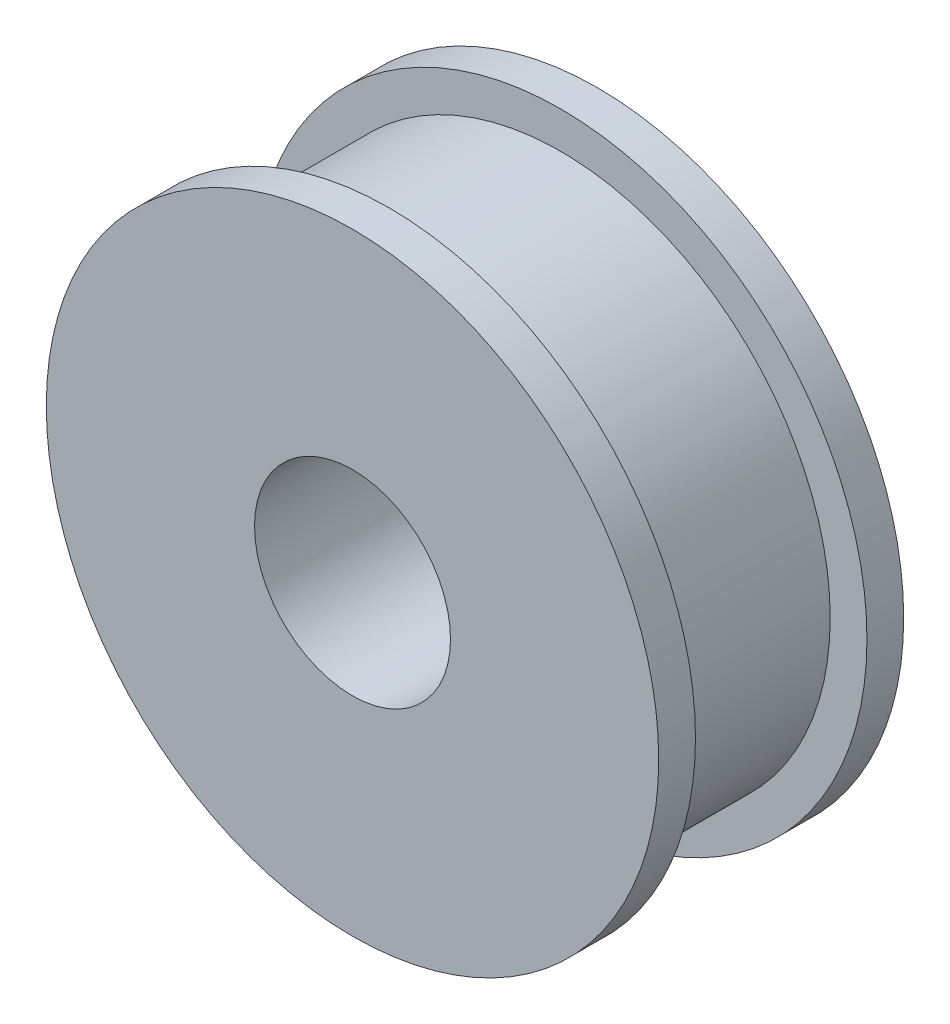
ISO-10303-21;
HEADER;
FILE_DESCRIPTION(('STEP AP214'),'2;1');
FILE_NAME('part.step','',(''),(''),'','','');
FILE_SCHEMA(('AUTOMOTIVE_DESIGN { 1 0 10303 214 1 1 1 1 }'));
ENDSEC;
DATA;
#1=APPLICATION_CONTEXT('core data for automotive mechanical design processes');
#2=APPLICATION_PROTOCOL_DEFINITION('international standard','automotive_design',2000,#1);
#3=PRODUCT_CONTEXT('',#1,'mechanical');
#4=PRODUCT('Part','Part','',(#3));
#5=PRODUCT_RELATED_PRODUCT_CATEGORY('part','',(#4));
#6=PRODUCT_DEFINITION_FORMATION('','',#4);
#7=PRODUCT_DEFINITION_CONTEXT('part definition',#1,'design');
#8=PRODUCT_DEFINITION('design','',#6,#7);
#9=PRODUCT_DEFINITION_SHAPE('','',#8);
#10=(LENGTH_UNIT() NAMED_UNIT(*) SI_UNIT(.MILLI.,.METRE.));
#11=(NAMED_UNIT(*) PLANE_ANGLE_UNIT() SI_UNIT($,.RADIAN.));
#12=(NAMED_UNIT(*) SI_UNIT($,.STERADIAN.) SOLID_ANGLE_UNIT());
#13=UNCERTAINTY_MEASURE_WITH_UNIT(LENGTH_MEASURE(1.E-05),#10,'distance_accuracy_value','');
#14=(GEOMETRIC_REPRESENTATION_CONTEXT(3) GLOBAL_UNCERTAINTY_ASSIGNED_CONTEXT((#13)) GLOBAL_UNIT_ASSIGNED_CONTEXT((#10,
#11,#12)) REPRESENTATION_CONTEXT('',''));
#15=CARTESIAN_POINT('',(0.,0.,0.));
#16=DIRECTION('',(0.,0.,1.));
#17=DIRECTION('',(1.,0.,0.));
#18=AXIS2_PLACEMENT_3D('',#15,#16,#17);
#19=CARTESIAN_POINT('',(0.,0.,10.));
#20=DIRECTION('',(0.,0.,-1.));
#21=DIRECTION('',(-1.,0.,0.));
#22=AXIS2_PLACEMENT_3D('',#19,#20,#21);
#23=CYLINDRICAL_SURFACE('',#22,12.5);
#24=CARTESIAN_POINT('',(0.,0.,0.));
#25=DIRECTION('',(0.,0.,1.));
#26=DIRECTION('',(1.,0.,0.));
#27=AXIS2_PLACEMENT_3D('',#24,#25,#26);
#28=CIRCLE('',#27,12.5);
#29=CARTESIAN_POINT('',(12.5,0.,0.));
#30=VERTEX_POINT('',#29);
#31=EDGE_CURVE('E60',#30,#30,#28,.T.);
#32=ORIENTED_EDGE('',*,*,#31,.T.);
#33=EDGE_LOOP('',(#32));
#34=FACE_BOUND('',#33,.T.);
#35=CARTESIAN_POINT('',(0.,0.,1.5));
#36=DIRECTION('',(0.,0.,1.));
#37=DIRECTION('',(1.,0.,0.));
#38=AXIS2_PLACEMENT_3D('',#35,#36,#37);
#39=CIRCLE('',#38,12.5);
#40=CARTESIAN_POINT('',(12.5,0.,1.5));
#41=VERTEX_POINT('',#40);
#42=EDGE_CURVE('E68',#41,#41,#39,.T.);
#43=ORIENTED_EDGE('',*,*,#42,.F.);
#44=EDGE_LOOP('',(#43));
#45=FACE_BOUND('',#44,.T.);
#46=ADVANCED_FACE('F47',(#34,#45),#23,.T.);
#47=CARTESIAN_POINT('',(0.,0.,10.));
#48=DIRECTION('',(0.,0.,-1.));
#49=DIRECTION('',(-1.,0.,0.));
#50=AXIS2_PLACEMENT_3D('',#47,#48,#49);
#51=CYLINDRICAL_SURFACE('',#50,4.);
#52=CARTESIAN_POINT('',(0.,0.,10.));
#53=DIRECTION('',(0.,0.,1.));
#54=DIRECTION('',(1.,0.,0.));
#55=AXIS2_PLACEMENT_3D('',#52,#53,#54);
#56=CIRCLE('',#55,4.);
#57=CARTESIAN_POINT('',(4.,0.,10.));
#58=VERTEX_POINT('',#57);
#59=EDGE_CURVE('E55',#58,#58,#56,.T.);
#60=ORIENTED_EDGE('',*,*,#59,.T.);
#61=EDGE_LOOP('',(#60));
#62=FACE_BOUND('',#61,.T.);
#63=CARTESIAN_POINT('',(0.,0.,0.));
#64=DIRECTION('',(0.,0.,1.));
#65=DIRECTION('',(1.,0.,0.));
#66=AXIS2_PLACEMENT_3D('',#63,#64,#65);
#67=CIRCLE('',#66,4.);
#68=CARTESIAN_POINT('',(4.,0.,0.));
#69=VERTEX_POINT('',#68);
#70=EDGE_CURVE('E64',#69,#69,#67,.T.);
#71=ORIENTED_EDGE('',*,*,#70,.F.);
#72=EDGE_LOOP('',(#71));
#73=FACE_BOUND('',#72,.T.);
#74=ADVANCED_FACE('F49',(#62,#73),#51,.F.);
#75=CARTESIAN_POINT('',(0.,0.,8.5));
#76=DIRECTION('',(0.,0.,1.));
#77=DIRECTION('',(1.,0.,0.));
#78=AXIS2_PLACEMENT_3D('',#75,#76,#77);
#79=CIRCLE('',#78,12.5);
#80=CARTESIAN_POINT('',(12.5,0.,8.5));
#81=VERTEX_POINT('',#80);
#82=EDGE_CURVE('E51',#81,#81,#79,.T.);
#83=ORIENTED_EDGE('',*,*,#82,.T.);
#84=EDGE_LOOP('',(#83));
#85=FACE_BOUND('',#84,.T.);
#86=CARTESIAN_POINT('',(0.,0.,10.));
#87=DIRECTION('',(0.,0.,1.));
#88=DIRECTION('',(1.,0.,0.));
#89=AXIS2_PLACEMENT_3D('',#86,#87,#88);
#90=CIRCLE('',#89,12.5);
#91=CARTESIAN_POINT('',(12.5,0.,10.));
#92=VERTEX_POINT('',#91);
#93=EDGE_CURVE('E11',#92,#92,#90,.T.);
#94=ORIENTED_EDGE('',*,*,#93,.F.);
#95=EDGE_LOOP('',(#94));
#96=FACE_BOUND('',#95,.T.);
#97=ADVANCED_FACE('F99',(#85,#96),#23,.T.);
#98=CARTESIAN_POINT('',(0.,0.,10.));
#99=DIRECTION('',(0.,0.,1.));
#100=DIRECTION('',(1.,0.,0.));
#101=AXIS2_PLACEMENT_3D('',#98,#99,#100);
#102=PLANE('',#101);
#103=ORIENTED_EDGE('',*,*,#59,.F.);
#104=EDGE_LOOP('',(#103));
#105=FACE_BOUND('',#104,.T.);
#106=ORIENTED_EDGE('',*,*,#93,.T.);
#107=EDGE_LOOP('',(#106));
#108=FACE_BOUND('',#107,.T.);
#109=ADVANCED_FACE('F108',(#105,#108),#102,.T.);
#110=CARTESIAN_POINT('',(0.,0.,0.));
#111=DIRECTION('',(0.,0.,1.));
#112=DIRECTION('',(1.,0.,0.));
#113=AXIS2_PLACEMENT_3D('',#110,#111,#112);
#114=PLANE('',#113);
#115=ORIENTED_EDGE('',*,*,#70,.T.);
#116=EDGE_LOOP('',(#115));
#117=FACE_BOUND('',#116,.T.);
#118=ORIENTED_EDGE('',*,*,#31,.F.);
#119=EDGE_LOOP('',(#118));
#120=FACE_BOUND('',#119,.T.);
#121=ADVANCED_FACE('F94',(#117,#120),#114,.F.);
#122=CARTESIAN_POINT('',(0.,0.,8.5));
#123=DIRECTION('',(0.,0.,1.));
#124=DIRECTION('',(1.,0.,0.));
#125=AXIS2_PLACEMENT_3D('',#122,#123,#124);
#126=PLANE('',#125);
#127=CARTESIAN_POINT('',(0.,0.,8.5));
#128=DIRECTION('',(0.,0.,1.));
#129=DIRECTION('',(1.,0.,0.));
#130=AXIS2_PLACEMENT_3D('',#127,#128,#129);
#131=CIRCLE('',#130,11.);
#132=CARTESIAN_POINT('',(11.,0.,8.5));
#133=VERTEX_POINT('',#132);
#134=EDGE_CURVE('E70',#133,#133,#131,.T.);
#135=ORIENTED_EDGE('',*,*,#134,.T.);
#136=EDGE_LOOP('',(#135));
#137=FACE_BOUND('',#136,.T.);
#138=ORIENTED_EDGE('',*,*,#82,.F.);
#139=EDGE_LOOP('',(#138));
#140=FACE_BOUND('',#139,.T.);
#141=ADVANCED_FACE('F86',(#137,#140),#126,.F.);
#142=CARTESIAN_POINT('',(0.,0.,1.5));
#143=DIRECTION('',(0.,0.,1.));
#144=DIRECTION('',(1.,0.,0.));
#145=AXIS2_PLACEMENT_3D('',#142,#143,#144);
#146=PLANE('',#145);
#147=CARTESIAN_POINT('',(0.,0.,1.5));
#148=DIRECTION('',(0.,0.,1.));
#149=DIRECTION('',(1.,0.,0.));
#150=AXIS2_PLACEMENT_3D('',#147,#148,#149);
#151=CIRCLE('',#150,11.);
#152=CARTESIAN_POINT('',(11.,0.,1.5));
#153=VERTEX_POINT('',#152);
#154=EDGE_CURVE('E75',#153,#153,#151,.T.);
#155=ORIENTED_EDGE('',*,*,#154,.F.);
#156=EDGE_LOOP('',(#155));
#157=FACE_BOUND('',#156,.T.);
#158=ORIENTED_EDGE('',*,*,#42,.T.);
#159=EDGE_LOOP('',(#158));
#160=FACE_BOUND('',#159,.T.);
#161=ADVANCED_FACE('F84',(#157,#160),#146,.T.);
#162=CARTESIAN_POINT('',(0.,0.,8.5));
#163=DIRECTION('',(0.,0.,-1.));
#164=DIRECTION('',(-1.,0.,0.));
#165=AXIS2_PLACEMENT_3D('',#162,#163,#164);
#166=CYLINDRICAL_SURFACE('',#165,11.);
#167=ORIENTED_EDGE('',*,*,#134,.F.);
#168=EDGE_LOOP('',(#167));
#169=FACE_BOUND('',#168,.T.);
#170=ORIENTED_EDGE('',*,*,#154,.T.);
#171=EDGE_LOOP('',(#170));
#172=FACE_BOUND('',#171,.T.);
#173=ADVANCED_FACE('F82',(#169,#172),#166,.T.);
#174=CLOSED_SHELL('',(#46,#74,#97,#109,#121,#141,#161,#173));
#175=MANIFOLD_SOLID_BREP('B2',#174);
#176=ADVANCED_BREP_SHAPE_REPRESENTATION('',(#18,#175),#14);
#177=SHAPE_DEFINITION_REPRESENTATION(#9,#176);
ENDSEC;
END-ISO-10303-21;
